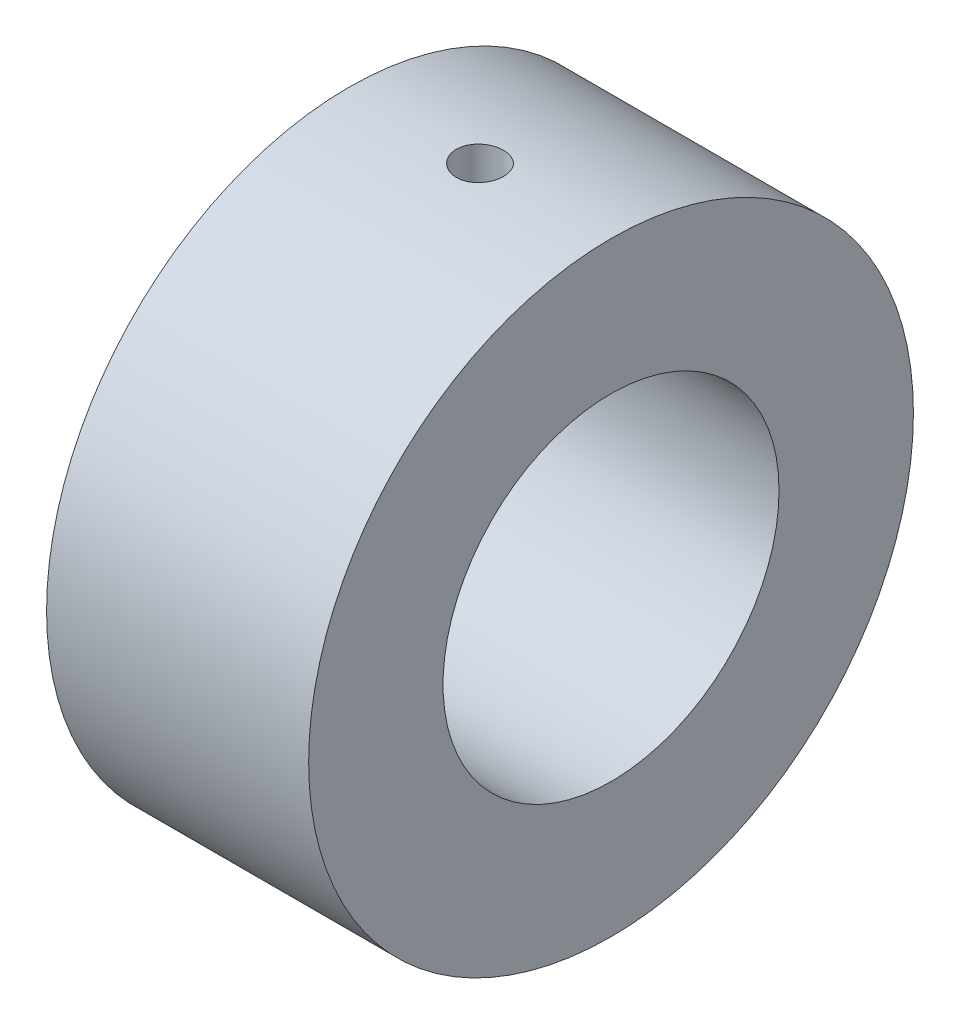
ISO-10303-21;
HEADER;
FILE_DESCRIPTION(('STEP AP214'),'2;1');
FILE_NAME('part.step','',(''),(''),'','','');
FILE_SCHEMA(('AUTOMOTIVE_DESIGN { 1 0 10303 214 1 1 1 1 }'));
ENDSEC;
DATA;
#1=APPLICATION_CONTEXT('core data for automotive mechanical design processes');
#2=APPLICATION_PROTOCOL_DEFINITION('international standard','automotive_design',2000,#1);
#3=PRODUCT_CONTEXT('',#1,'mechanical');
#4=PRODUCT('Part','Part','',(#3));
#5=PRODUCT_RELATED_PRODUCT_CATEGORY('part','',(#4));
#6=PRODUCT_DEFINITION_FORMATION('','',#4);
#7=PRODUCT_DEFINITION_CONTEXT('part definition',#1,'design');
#8=PRODUCT_DEFINITION('design','',#6,#7);
#9=PRODUCT_DEFINITION_SHAPE('','',#8);
#10=(LENGTH_UNIT() NAMED_UNIT(*) SI_UNIT(.MILLI.,.METRE.));
#11=(NAMED_UNIT(*) PLANE_ANGLE_UNIT() SI_UNIT($,.RADIAN.));
#12=(NAMED_UNIT(*) SI_UNIT($,.STERADIAN.) SOLID_ANGLE_UNIT());
#13=UNCERTAINTY_MEASURE_WITH_UNIT(LENGTH_MEASURE(1.E-05),#10,'distance_accuracy_value','');
#14=(GEOMETRIC_REPRESENTATION_CONTEXT(3) GLOBAL_UNCERTAINTY_ASSIGNED_CONTEXT((#13)) GLOBAL_UNIT_ASSIGNED_CONTEXT((#10,
#11,#12)) REPRESENTATION_CONTEXT('',''));
#15=CARTESIAN_POINT('',(0.,0.,0.));
#16=DIRECTION('',(0.,0.,1.));
#17=DIRECTION('',(1.,0.,0.));
#18=AXIS2_PLACEMENT_3D('',#15,#16,#17);
#19=CARTESIAN_POINT('',(54.9038461538462,0.,0.));
#20=DIRECTION('',(1.,0.,0.));
#21=DIRECTION('',(0.,0.,-1.));
#22=AXIS2_PLACEMENT_3D('',#19,#20,#21);
#23=CYLINDRICAL_SURFACE('',#22,25.);
#24=CARTESIAN_POINT('',(-19.5,0.,0.));
#25=DIRECTION('',(1.,0.,0.));
#26=DIRECTION('',(0.,0.,-1.));
#27=AXIS2_PLACEMENT_3D('',#24,#25,#26);
#28=CIRCLE('',#27,25.);
#29=CARTESIAN_POINT('',(-19.5,0.,-25.));
#30=VERTEX_POINT('',#29);
#31=EDGE_CURVE('E47',#30,#30,#28,.T.);
#32=ORIENTED_EDGE('',*,*,#31,.F.);
#33=EDGE_LOOP('',(#32));
#34=FACE_BOUND('',#33,.T.);
#35=CARTESIAN_POINT('',(19.5,0.,0.));
#36=DIRECTION('',(1.,0.,0.));
#37=DIRECTION('',(0.,0.,-1.));
#38=AXIS2_PLACEMENT_3D('',#35,#36,#37);
#39=CIRCLE('',#38,25.);
#40=CARTESIAN_POINT('',(19.5,0.,-25.));
#41=VERTEX_POINT('',#40);
#42=EDGE_CURVE('E51',#41,#41,#39,.T.);
#43=ORIENTED_EDGE('',*,*,#42,.T.);
#44=EDGE_LOOP('',(#43));
#45=FACE_BOUND('',#44,.T.);
#46=CARTESIAN_POINT('',(0.,24.7522725030947,-3.51069878123209));
#47=CARTESIAN_POINT('',(-0.196151559335902,24.7522756135237,-3.51069057727034));
#48=CARTESIAN_POINT('',(-0.39242051850679,24.7546293409589,-3.49420401753494));
#49=CARTESIAN_POINT('',(-0.779481196706494,24.7637847057256,-3.42870506865156));
#50=CARTESIAN_POINT('',(-0.970267218743328,24.7705908063865,-3.37966004018607));
#51=CARTESIAN_POINT('',(-1.34070282775259,24.7878651706259,-3.25053160205205));
#52=CARTESIAN_POINT('',(-1.52036045021575,24.7983307546408,-3.17047089820769));
#53=CARTESIAN_POINT('',(-1.86366265610098,24.8217416825655,-2.98163535447336));
#54=CARTESIAN_POINT('',(-2.02730965330359,24.8346866518074,-2.87286485207775));
#55=CARTESIAN_POINT('',(-2.33512451546809,24.8616996022581,-2.62887971990459));
#56=CARTESIAN_POINT('',(-2.47916348867206,24.8757741303066,-2.49350318400972));
#57=CARTESIAN_POINT('',(-2.74255802287131,24.9034017551605,-2.20049811406323));
#58=CARTESIAN_POINT('',(-2.86191228004945,24.9169548243924,-2.0428684053652));
#59=CARTESIAN_POINT('',(-3.07302000433629,24.9420804346765,-1.70901154507852));
#60=CARTESIAN_POINT('',(-3.16465553855329,24.9536444254514,-1.53270912269481));
#61=CARTESIAN_POINT('',(-3.31696840763615,24.9734166262569,-1.16702692936662));
#62=CARTESIAN_POINT('',(-3.37764718081145,24.9816249921925,-0.977647766456407));
#63=CARTESIAN_POINT('',(-3.46593544622559,24.9937149225135,-0.592512182512272));
#64=CARTESIAN_POINT('',(-3.49376025138701,24.9976246468614,-0.396806017905524));
#65=CARTESIAN_POINT('',(-3.51621878433848,25.0007731509887,-0.00346595116562052));
#66=CARTESIAN_POINT('',(-3.51085413972002,25.0000121598175,0.194167855962507));
#67=CARTESIAN_POINT('',(-3.46725703440056,24.9939275890444,0.584285765696402));
#68=CARTESIAN_POINT('',(-3.42925618260858,24.9886361613402,0.776796323840267));
#69=CARTESIAN_POINT('',(-3.32182831396536,24.9741211500334,1.15268076864619));
#70=CARTESIAN_POINT('',(-3.25240057120413,24.9648974756026,1.33605444415252));
#71=CARTESIAN_POINT('',(-3.08384891667519,24.9434989521037,1.68916729925594));
#72=CARTESIAN_POINT('',(-2.98462640371513,24.9313143301781,1.85885879715095));
#73=CARTESIAN_POINT('',(-2.75937364777411,24.9053540263577,2.17927036611437));
#74=CARTESIAN_POINT('',(-2.63334185560761,24.8915782525386,2.32998934004596));
#75=CARTESIAN_POINT('',(-2.35675502617426,24.863833940919,2.60954096613214));
#76=CARTESIAN_POINT('',(-2.20599791277843,24.8498647651947,2.73817370381601));
#77=CARTESIAN_POINT('',(-1.88492949390974,24.8234244690402,2.96834333229174));
#78=CARTESIAN_POINT('',(-1.71461809448127,24.8109533558086,3.06988009288346));
#79=CARTESIAN_POINT('',(-1.35907949602503,24.7889215753614,3.24299618211863));
#80=CARTESIAN_POINT('',(-1.17384306655473,24.7793627269905,3.31455679968406));
#81=CARTESIAN_POINT('',(-0.793817342692021,24.7642712114383,3.42549781765691));
#82=CARTESIAN_POINT('',(-0.599028635466062,24.7587382971182,3.46488019339852));
#83=CARTESIAN_POINT('',(-0.207201087290289,24.7523713624406,3.51007644972774));
#84=CARTESIAN_POINT('',(-0.0101954585742676,24.751497790795,3.51617289175313));
#85=CARTESIAN_POINT('',(0.382025956013066,24.7544436129972,3.4953722882658));
#86=CARTESIAN_POINT('',(0.577241790203367,24.7582628797746,3.46847613611052));
#87=CARTESIAN_POINT('',(0.959478363541748,24.7701278134235,3.38269278529255));
#88=CARTESIAN_POINT('',(1.14653095735886,24.7781550887341,3.3239447607269));
#89=CARTESIAN_POINT('',(1.50813263026716,24.7975165161844,3.17626946398032));
#90=CARTESIAN_POINT('',(1.68268116238102,24.8088508128765,3.08734087255663));
#91=CARTESIAN_POINT('',(2.01559132043441,24.8336430193884,2.88114352871929));
#92=CARTESIAN_POINT('',(2.17383802968137,24.8471145025315,2.76369090033093));
#93=CARTESIAN_POINT('',(2.46847473072674,24.8746216302035,2.50403687975436));
#94=CARTESIAN_POINT('',(2.60486364296185,24.888657302555,2.36183426587993));
#95=CARTESIAN_POINT('',(2.85291897908659,24.9158341215369,2.05547651791413));
#96=CARTESIAN_POINT('',(2.96439877991558,24.9289680362189,1.89116954162218));
#97=CARTESIAN_POINT('',(3.15817478655915,24.9527508932757,1.54599741001639));
#98=CARTESIAN_POINT('',(3.24047170851086,24.963399896627,1.36513266116126));
#99=CARTESIAN_POINT('',(3.37324360773878,24.9809812356825,0.99257679669806));
#100=CARTESIAN_POINT('',(3.42382296094559,24.9879257507003,0.800923477541973));
#101=CARTESIAN_POINT('',(3.49206251117375,24.9973665675172,0.411739652629555));
#102=CARTESIAN_POINT('',(3.509724602613,24.9998631252998,0.21420948575584));
#103=CARTESIAN_POINT('',(3.51158640839394,25.0001247198907,-0.179306004615065));
#104=CARTESIAN_POINT('',(3.49607254937341,24.9979302569807,-0.375290006865239));
#105=CARTESIAN_POINT('',(3.43263382848844,24.9891375540242,-0.761834286940135));
#106=CARTESIAN_POINT('',(3.38470903466737,24.9825393232229,-0.952394576150503));
#107=CARTESIAN_POINT('',(3.25790587119443,24.965676951489,-1.32261991854149));
#108=CARTESIAN_POINT('',(3.17904489770042,24.9554148711182,-1.50229102952877));
#109=CARTESIAN_POINT('',(2.99263800816678,24.9323556360647,-1.84589561995705));
#110=CARTESIAN_POINT('',(2.88509139523318,24.9195584197949,-2.00982871692436));
#111=CARTESIAN_POINT('',(2.64332026429438,24.8927223092116,-2.31876122053728));
#112=CARTESIAN_POINT('',(2.50888349874355,24.8786740638049,-2.46359372284325));
#113=CARTESIAN_POINT('',(2.21759380470955,24.8509907650968,-2.72875025943341));
#114=CARTESIAN_POINT('',(2.06073560755184,24.8373558098273,-2.84906851710299));
#115=CARTESIAN_POINT('',(1.72816094484796,24.8119716070397,-3.06230084099106));
#116=CARTESIAN_POINT('',(1.55235602077342,24.8002319057879,-3.15507803618131));
#117=CARTESIAN_POINT('',(1.1875838811002,24.7800791731181,-3.30965345054521));
#118=CARTESIAN_POINT('',(0.998630833663955,24.7716626240838,-3.37148444548728));
#119=CARTESIAN_POINT('',(0.673979018002457,24.7610940141643,-3.44806640979329));
#120=CARTESIAN_POINT('',(0.540303728449153,24.7578030509756,-3.47151849900812));
#121=CARTESIAN_POINT('',(0.271104309122545,24.7533912319884,-3.50283743733128));
#122=CARTESIAN_POINT('',(0.135580198983353,24.7522703531623,-3.51070445182053));
#123=CARTESIAN_POINT('',(0.,24.7522725030947,-3.51069878123209));
#124=B_SPLINE_CURVE_WITH_KNOTS('',3,(#46,#47,#48,#49,#50,#51,#52,#53,#54,#55,#56,#57,#58,#59,
#60,#61,#62,#63,#64,#65,#66,#67,#68,#69,#70,#71,#72,#73,#74,#75,#76,#77,#78,#79,#80,#81,#82,#83,
#84,#85,#86,#87,#88,#89,#90,#91,#92,#93,#94,#95,#96,#97,#98,#99,#100,#101,#102,#103,#104,#105,
#106,#107,#108,#109,#110,#111,#112,#113,#114,#115,#116,#117,#118,#119,#120,#121,#122,#123),
.UNSPECIFIED.,.T.,.F.,(4,2,2,2,2,2,2,2,2,2,2,2,2,2,2,2,2,2,2,2,2,2,2,2,2,2,2,2,2,2,2,2,2,2,2,2,
2,2,4),(0.,0.587959228030982,1.17650876718981,1.76462825522892,2.35265894061552,2.9443854303946,
3.5361431664808,4.13038430234409,4.72459782612947,5.31489508642913,5.90516339912095,
6.49127705421071,7.0774042482623,7.66549292676159,8.25361559745028,8.84680921370486,
9.4400056802905,10.0335718697369,10.6271016190413,11.2155850195151,11.8040524856729,
12.3899691741488,12.9759114773166,13.5657361991915,14.155590043718,14.7497251019702,
15.3438455793573,15.9360005257202,16.528121391983,17.1151507958883,17.7021789673903,
18.2888775109276,18.8755903091212,19.4671311136645,20.058811149959,20.6533842422317,
21.2473262700132,21.65372872389,22.060126865207),.UNSPECIFIED.);
#125=CARTESIAN_POINT('',(0.,24.7522725030947,-3.51069878123209));
#126=VERTEX_POINT('',#125);
#127=EDGE_CURVE('E63',#126,#126,#124,.T.);
#128=ORIENTED_EDGE('',*,*,#127,.T.);
#129=EDGE_LOOP('',(#128));
#130=FACE_BOUND('',#129,.T.);
#131=ADVANCED_FACE('F35',(#34,#45,#130),#23,.F.);
#132=CARTESIAN_POINT('',(54.9038461538462,0.,0.));
#133=DIRECTION('',(1.,0.,0.));
#134=DIRECTION('',(0.,0.,-1.));
#135=AXIS2_PLACEMENT_3D('',#132,#133,#134);
#136=CYLINDRICAL_SURFACE('',#135,45.);
#137=CARTESIAN_POINT('',(-19.5,0.,0.));
#138=DIRECTION('',(1.,0.,0.));
#139=DIRECTION('',(0.,0.,-1.));
#140=AXIS2_PLACEMENT_3D('',#137,#138,#139);
#141=CIRCLE('',#140,45.);
#142=CARTESIAN_POINT('',(-19.5,0.,-45.));
#143=VERTEX_POINT('',#142);
#144=EDGE_CURVE('E60',#143,#143,#141,.T.);
#145=ORIENTED_EDGE('',*,*,#144,.T.);
#146=EDGE_LOOP('',(#145));
#147=FACE_BOUND('',#146,.T.);
#148=CARTESIAN_POINT('',(19.5,0.,0.));
#149=DIRECTION('',(1.,0.,0.));
#150=DIRECTION('',(0.,0.,-1.));
#151=AXIS2_PLACEMENT_3D('',#148,#149,#150);
#152=CIRCLE('',#151,45.);
#153=CARTESIAN_POINT('',(19.5,0.,-45.));
#154=VERTEX_POINT('',#153);
#155=EDGE_CURVE('E55',#154,#154,#152,.T.);
#156=ORIENTED_EDGE('',*,*,#155,.F.);
#157=EDGE_LOOP('',(#156));
#158=FACE_BOUND('',#157,.T.);
#159=CARTESIAN_POINT('',(3.51069878123209,45.,0.));
#160=CARTESIAN_POINT('',(3.51069016327321,44.9999981982515,0.196876309742928));
#161=CARTESIAN_POINT('',(3.49408216502679,44.9986942047826,0.393887726195684));
#162=CARTESIAN_POINT('',(3.42807237171708,44.9936176879928,0.782462750306387));
#163=CARTESIAN_POINT('',(3.37863313655254,44.989842346465,0.974019877606805));
#164=CARTESIAN_POINT('',(3.24839650055242,44.9802498956538,1.34600209402133));
#165=CARTESIAN_POINT('',(3.16761650465523,44.9744339197979,1.52643329752065));
#166=CARTESIAN_POINT('',(2.97702173569917,44.9614129676254,1.87113121607607));
#167=CARTESIAN_POINT('',(2.86721329683557,44.9542082944244,2.03540144684463));
#168=CARTESIAN_POINT('',(2.62141081765724,44.9392006467053,2.34352869706462));
#169=CARTESIAN_POINT('',(2.48536497384483,44.931396507245,2.48734433814456));
#170=CARTESIAN_POINT('',(2.19105847121725,44.9160793201559,2.75012523148537));
#171=CARTESIAN_POINT('',(2.03279685080001,44.9085662851455,2.86908940750443));
#172=CARTESIAN_POINT('',(1.69830409662831,44.8946691277055,3.07892786802771));
#173=CARTESIAN_POINT('',(1.52205034695304,44.8882864543737,3.16976620584417));
#174=CARTESIAN_POINT('',(1.15673438537259,44.8773855141354,3.32054473340071));
#175=CARTESIAN_POINT('',(0.967672374647507,44.872867217953,3.38048540832491));
#176=CARTESIAN_POINT('',(0.582518074596996,44.8662160538212,3.46764816703966));
#177=CARTESIAN_POINT('',(0.386441009424286,44.864078309411,3.49493714504381));
#178=CARTESIAN_POINT('',(-0.00752130226992439,44.8624147485703,3.51622849169206));
#179=CARTESIAN_POINT('',(-0.205406518607657,44.8628888886184,3.51023141497602));
#180=CARTESIAN_POINT('',(-0.59691021898334,44.8663911056592,3.46517622652998));
#181=CARTESIAN_POINT('',(-0.790537116302866,44.8694135735581,3.42619072454654));
#182=CARTESIAN_POINT('',(-1.16849055474424,44.8776630682018,3.3163780970723));
#183=CARTESIAN_POINT('',(-1.35281701487996,44.8828901141397,3.24555069436257));
#184=CARTESIAN_POINT('',(-1.70716916629856,44.8949662401907,3.07398317680426));
#185=CARTESIAN_POINT('',(-1.87717897267757,44.9018170906621,2.973210383252));
#186=CARTESIAN_POINT('',(-2.19789816947571,44.9163672041587,2.74463624076038));
#187=CARTESIAN_POINT('',(-2.34860721796533,44.92406648221,2.61683441308478));
#188=CARTESIAN_POINT('',(-2.62686908374494,44.9394708414183,2.33742229949295));
#189=CARTESIAN_POINT('',(-2.7543588615536,44.9471758829786,2.185749222942));
#190=CARTESIAN_POINT('',(-2.98207614023572,44.9617038943704,1.86311940921007));
#191=CARTESIAN_POINT('',(-3.08230362570958,44.9685268637037,1.69216266113643));
#192=CARTESIAN_POINT('',(-3.25264690956149,44.9805230175911,1.33577813187535));
#193=CARTESIAN_POINT('',(-3.32276003007018,44.9856960554174,1.15034906549311));
#194=CARTESIAN_POINT('',(-3.43084076780538,44.9938077219013,0.770301864054383));
#195=CARTESIAN_POINT('',(-3.46880896970519,44.9967463911991,0.575683896199765));
#196=CARTESIAN_POINT('',(-3.51144331700848,45.0000529868884,0.183329944307448));
#197=CARTESIAN_POINT('',(-3.51619656001214,45.0004276367016,-0.0143965212352969));
#198=CARTESIAN_POINT('',(-3.49249406044233,44.9985819160886,-0.40783507035813));
#199=CARTESIAN_POINT('',(-3.46403858884012,44.9963615668367,-0.603547170361575));
#200=CARTESIAN_POINT('',(-3.37479857539064,44.9895799461172,-0.987153941880403));
#201=CARTESIAN_POINT('',(-3.3140542888594,44.9850215897524,-1.17505803402896));
#202=CARTESIAN_POINT('',(-3.16200200120939,44.9740762344884,-1.53800640642892));
#203=CARTESIAN_POINT('',(-3.07069357494614,44.9676892101527,-1.71305050775768));
#204=CARTESIAN_POINT('',(-2.85988523779655,44.9537862083893,-2.04570711162377));
#205=CARTESIAN_POINT('',(-2.74032749331616,44.9462679266105,-2.20328286656208));
#206=CARTESIAN_POINT('',(-2.47649804630772,44.9309552448121,-2.4961591236469));
#207=CARTESIAN_POINT('',(-2.3322259673305,44.9231608405881,-2.63145928642964));
#208=CARTESIAN_POINT('',(-2.0226858628831,44.9081545978948,-2.87624140076919));
#209=CARTESIAN_POINT('',(-1.85737289324737,44.9009440621823,-2.98566660889842));
#210=CARTESIAN_POINT('',(-1.51066794847507,44.8879398568507,-3.17520383436569));
#211=CARTESIAN_POINT('',(-1.32927611679225,44.8821461745923,-3.25531611319763));
#212=CARTESIAN_POINT('',(-0.955765202206923,44.8726386003134,-3.38385627120564));
#213=CARTESIAN_POINT('',(-0.763658228866234,44.8689224107976,-3.43231916140091));
#214=CARTESIAN_POINT('',(-0.374003757417177,44.8639826526849,-3.49629895011258));
#215=CARTESIAN_POINT('',(-0.176456349507717,44.8627590427879,-3.51181639451062));
#216=CARTESIAN_POINT('',(0.21790739143662,44.862943485503,-3.50945883260674));
#217=CARTESIAN_POINT('',(0.414724266974422,44.8643445108251,-3.49167299374062));
#218=CARTESIAN_POINT('',(0.802566926788803,44.8696054422224,-3.42339937607345));
#219=CARTESIAN_POINT('',(0.993592701697413,44.8734653522749,-3.372911544375));
#220=CARTESIAN_POINT('',(1.3644384299895,44.8832073082598,-3.24068905682146));
#221=CARTESIAN_POINT('',(1.54425884642114,44.8890892705677,-3.15895569314815));
#222=CARTESIAN_POINT('',(1.88763947055312,44.9022126600304,-2.96657266546068));
#223=CARTESIAN_POINT('',(2.05119997998941,44.9094540619508,-2.85592353817623));
#224=CARTESIAN_POINT('',(2.35787358968023,44.9245033574654,-2.60851552235249));
#225=CARTESIAN_POINT('',(2.50093357174439,44.9323126463797,-2.47169087695999));
#226=CARTESIAN_POINT('',(2.76211193232531,44.9476051563542,-2.17592956276409));
#227=CARTESIAN_POINT('',(2.88022424901827,44.9550882978167,-2.01698753537039));
#228=CARTESIAN_POINT('',(3.08829229258412,44.9688971889695,-1.68123287264452));
#229=CARTESIAN_POINT('',(3.17820032092754,44.9752209705493,-1.50439062558631));
#230=CARTESIAN_POINT('',(3.32693389900969,44.9859748177965,-1.13819384045182));
#231=CARTESIAN_POINT('',(3.38579536836872,44.9904070707476,-0.948854048282458));
#232=CARTESIAN_POINT('',(3.45568692722327,44.9957339295528,-0.631987761923287));
#233=CARTESIAN_POINT('',(3.47628916448274,44.9973264722228,-0.50650217811363));
#234=CARTESIAN_POINT('',(3.50379785644992,44.9994600875776,-0.254029813577639));
#235=CARTESIAN_POINT('',(3.51070434234639,45.0000011626569,-0.127043036270572));
#236=CARTESIAN_POINT('',(3.51069878123209,45.,0.));
#237=B_SPLINE_CURVE_WITH_KNOTS('',3,(#159,#160,#161,#162,#163,#164,#165,#166,#167,#168,#169,
#170,#171,#172,#173,#174,#175,#176,#177,#178,#179,#180,#181,#182,#183,#184,#185,#186,#187,#188,
#189,#190,#191,#192,#193,#194,#195,#196,#197,#198,#199,#200,#201,#202,#203,#204,#205,#206,#207,
#208,#209,#210,#211,#212,#213,#214,#215,#216,#217,#218,#219,#220,#221,#222,#223,#224,#225,#226,
#227,#228,#229,#230,#231,#232,#233,#234,#235,#236),.UNSPECIFIED.,.T.,.F.,(4,2,2,2,2,2,2,2,2,2,2,
2,2,2,2,2,2,2,2,2,2,2,2,2,2,2,2,2,2,2,2,2,2,2,2,2,2,2,4),(0.,0.590165101483487,1.18100437411239,
1.77151599562286,2.36189886985935,2.95345956396283,3.54504587146272,4.13738517396568,
4.7297151747171,5.32082956733916,5.91193411035214,6.50174096664596,7.09155295795975,
7.68201097590606,8.27247945287659,8.86452788014866,9.45657664184925,10.0486780395981,
10.6407686675789,11.2313061071203,11.8218387281208,12.411636837416,13.0014431510919,
13.5924675746493,14.1835010015015,14.7758187792835,15.3681312730062,15.9597874270472,
16.5514337777076,17.1414982973489,17.7315637714569,18.3216048456159,18.9116349683064,
19.5031672763138,20.0948431508663,20.6875143276602,21.2794982952692,21.6603289662238,
22.0411587699279),.UNSPECIFIED.);
#238=CARTESIAN_POINT('',(3.51069878123209,45.,0.));
#239=VERTEX_POINT('',#238);
#240=EDGE_CURVE('E10',#239,#239,#237,.T.);
#241=ORIENTED_EDGE('',*,*,#240,.T.);
#242=EDGE_LOOP('',(#241));
#243=FACE_BOUND('',#242,.T.);
#244=ADVANCED_FACE('F75',(#147,#158,#243),#136,.T.);
#245=CARTESIAN_POINT('',(-19.5,45.,0.));
#246=DIRECTION('',(-1.,0.,0.));
#247=DIRECTION('',(0.,0.,1.));
#248=AXIS2_PLACEMENT_3D('',#245,#246,#247);
#249=PLANE('',#248);
#250=ORIENTED_EDGE('',*,*,#31,.T.);
#251=EDGE_LOOP('',(#250));
#252=FACE_BOUND('',#251,.T.);
#253=ORIENTED_EDGE('',*,*,#144,.F.);
#254=EDGE_LOOP('',(#253));
#255=FACE_BOUND('',#254,.T.);
#256=ADVANCED_FACE('F37',(#252,#255),#249,.T.);
#257=CARTESIAN_POINT('',(19.5,45.,0.));
#258=DIRECTION('',(1.,0.,0.));
#259=DIRECTION('',(0.,0.,-1.));
#260=AXIS2_PLACEMENT_3D('',#257,#258,#259);
#261=PLANE('',#260);
#262=ORIENTED_EDGE('',*,*,#155,.T.);
#263=EDGE_LOOP('',(#262));
#264=FACE_BOUND('',#263,.T.);
#265=ORIENTED_EDGE('',*,*,#42,.F.);
#266=EDGE_LOOP('',(#265));
#267=FACE_BOUND('',#266,.T.);
#268=ADVANCED_FACE('F73',(#264,#267),#261,.T.);
#269=CARTESIAN_POINT('',(0.,45.,0.));
#270=DIRECTION('',(0.,-1.,0.));
#271=DIRECTION('',(0.,0.,-1.));
#272=AXIS2_PLACEMENT_3D('',#269,#270,#271);
#273=CYLINDRICAL_SURFACE('',#272,3.51069878123209);
#274=ORIENTED_EDGE('',*,*,#127,.F.);
#275=EDGE_LOOP('',(#274));
#276=FACE_BOUND('',#275,.T.);
#277=ORIENTED_EDGE('',*,*,#240,.F.);
#278=EDGE_LOOP('',(#277));
#279=FACE_BOUND('',#278,.T.);
#280=ADVANCED_FACE('F70',(#276,#279),#273,.F.);
#281=CLOSED_SHELL('',(#131,#244,#256,#268,#280));
#282=MANIFOLD_SOLID_BREP('B2',#281);
#283=ADVANCED_BREP_SHAPE_REPRESENTATION('',(#18,#282),#14);
#284=SHAPE_DEFINITION_REPRESENTATION(#9,#283);
ENDSEC;
END-ISO-10303-21;
